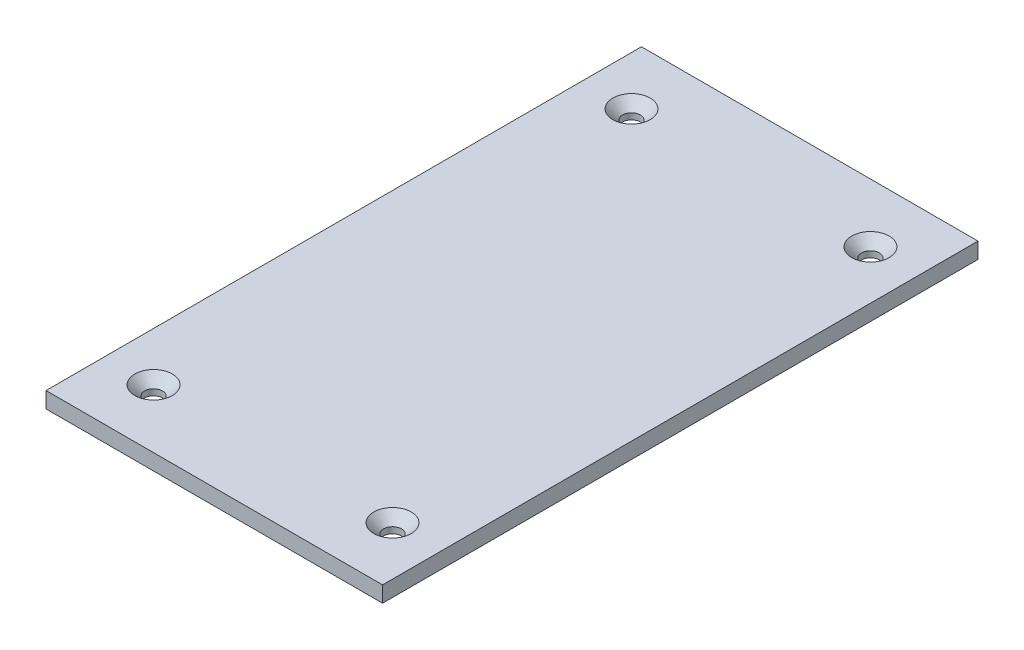
ISO-10303-21;
HEADER;
FILE_DESCRIPTION(('STEP AP214'),'2;1');
FILE_NAME('part.step','',(''),(''),'','','');
FILE_SCHEMA(('AUTOMOTIVE_DESIGN { 1 0 10303 214 1 1 1 1 }'));
ENDSEC;
DATA;
#1=APPLICATION_CONTEXT('core data for automotive mechanical design processes');
#2=APPLICATION_PROTOCOL_DEFINITION('international standard','automotive_design',2000,#1);
#3=PRODUCT_CONTEXT('',#1,'mechanical');
#4=PRODUCT('Part','Part','',(#3));
#5=PRODUCT_RELATED_PRODUCT_CATEGORY('part','',(#4));
#6=PRODUCT_DEFINITION_FORMATION('','',#4);
#7=PRODUCT_DEFINITION_CONTEXT('part definition',#1,'design');
#8=PRODUCT_DEFINITION('design','',#6,#7);
#9=PRODUCT_DEFINITION_SHAPE('','',#8);
#10=(LENGTH_UNIT() NAMED_UNIT(*) SI_UNIT(.MILLI.,.METRE.));
#11=(NAMED_UNIT(*) PLANE_ANGLE_UNIT() SI_UNIT($,.RADIAN.));
#12=(NAMED_UNIT(*) SI_UNIT($,.STERADIAN.) SOLID_ANGLE_UNIT());
#13=UNCERTAINTY_MEASURE_WITH_UNIT(LENGTH_MEASURE(1.E-05),#10,'distance_accuracy_value','');
#14=(GEOMETRIC_REPRESENTATION_CONTEXT(3) GLOBAL_UNCERTAINTY_ASSIGNED_CONTEXT((#13)) GLOBAL_UNIT_ASSIGNED_CONTEXT((#10,
#11,#12)) REPRESENTATION_CONTEXT('',''));
#15=CARTESIAN_POINT('',(0.,0.,0.));
#16=DIRECTION('',(0.,0.,1.));
#17=DIRECTION('',(1.,0.,0.));
#18=AXIS2_PLACEMENT_3D('',#15,#16,#17);
#19=CARTESIAN_POINT('',(-42.25,-4.,-74.75));
#20=DIRECTION('',(-1.,0.,0.));
#21=DIRECTION('',(0.,0.,1.));
#22=AXIS2_PLACEMENT_3D('',#19,#20,#21);
#23=PLANE('',#22);
#24=DIRECTION('',(0.,0.,1.));
#25=VECTOR('',#24,1.);
#26=CARTESIAN_POINT('',(-42.25,0.,-74.75));
#27=LINE('',#26,#25);
#28=CARTESIAN_POINT('',(-42.25,0.,-74.75));
#29=VERTEX_POINT('',#28);
#30=CARTESIAN_POINT('',(-42.25,0.,74.75));
#31=VERTEX_POINT('',#30);
#32=EDGE_CURVE('E101',#29,#31,#27,.T.);
#33=ORIENTED_EDGE('',*,*,#32,.F.);
#34=DIRECTION('',(0.,1.,0.));
#35=VECTOR('',#34,1.);
#36=CARTESIAN_POINT('',(-42.25,-4.,-74.75));
#37=LINE('',#36,#35);
#38=CARTESIAN_POINT('',(-42.25,-4.,-74.75));
#39=VERTEX_POINT('',#38);
#40=EDGE_CURVE('E11',#39,#29,#37,.T.);
#41=ORIENTED_EDGE('',*,*,#40,.F.);
#42=DIRECTION('',(0.,0.,1.));
#43=VECTOR('',#42,1.);
#44=CARTESIAN_POINT('',(-42.25,-4.,-74.75));
#45=LINE('',#44,#43);
#46=CARTESIAN_POINT('',(-42.25,-4.,74.75));
#47=VERTEX_POINT('',#46);
#48=EDGE_CURVE('E94',#39,#47,#45,.T.);
#49=ORIENTED_EDGE('',*,*,#48,.T.);
#50=DIRECTION('',(0.,1.,0.));
#51=VECTOR('',#50,1.);
#52=CARTESIAN_POINT('',(-42.25,-4.,74.75));
#53=LINE('',#52,#51);
#54=EDGE_CURVE('E39',#47,#31,#53,.T.);
#55=ORIENTED_EDGE('',*,*,#54,.T.);
#56=EDGE_LOOP('',(#33,#41,#49,#55));
#57=FACE_BOUND('',#56,.T.);
#58=ADVANCED_FACE('F36',(#57),#23,.T.);
#59=CARTESIAN_POINT('',(-42.25,-4.,-74.75));
#60=DIRECTION('',(0.,0.,-1.));
#61=DIRECTION('',(-1.,0.,0.));
#62=AXIS2_PLACEMENT_3D('',#59,#60,#61);
#63=PLANE('',#62);
#64=DIRECTION('',(-1.,0.,0.));
#65=VECTOR('',#64,1.);
#66=CARTESIAN_POINT('',(-42.25,0.,-74.75));
#67=LINE('',#66,#65);
#68=CARTESIAN_POINT('',(42.25,0.,-74.75));
#69=VERTEX_POINT('',#68);
#70=EDGE_CURVE('E96',#69,#29,#67,.T.);
#71=ORIENTED_EDGE('',*,*,#70,.F.);
#72=DIRECTION('',(0.,1.,0.));
#73=VECTOR('',#72,1.);
#74=CARTESIAN_POINT('',(42.25,-4.,-74.75));
#75=LINE('',#74,#73);
#76=CARTESIAN_POINT('',(42.25,-4.,-74.75));
#77=VERTEX_POINT('',#76);
#78=EDGE_CURVE('E45',#77,#69,#75,.T.);
#79=ORIENTED_EDGE('',*,*,#78,.F.);
#80=DIRECTION('',(-1.,0.,0.));
#81=VECTOR('',#80,1.);
#82=CARTESIAN_POINT('',(-42.25,-4.,-74.75));
#83=LINE('',#82,#81);
#84=EDGE_CURVE('E91',#77,#39,#83,.T.);
#85=ORIENTED_EDGE('',*,*,#84,.T.);
#86=ORIENTED_EDGE('',*,*,#40,.T.);
#87=EDGE_LOOP('',(#71,#79,#85,#86));
#88=FACE_BOUND('',#87,.T.);
#89=ADVANCED_FACE('F112',(#88),#63,.T.);
#90=CARTESIAN_POINT('',(42.25,-4.,-74.75));
#91=DIRECTION('',(1.,0.,0.));
#92=DIRECTION('',(0.,0.,-1.));
#93=AXIS2_PLACEMENT_3D('',#90,#91,#92);
#94=PLANE('',#93);
#95=DIRECTION('',(0.,0.,-1.));
#96=VECTOR('',#95,1.);
#97=CARTESIAN_POINT('',(42.25,0.,-74.75));
#98=LINE('',#97,#96);
#99=CARTESIAN_POINT('',(42.25,0.,74.75));
#100=VERTEX_POINT('',#99);
#101=EDGE_CURVE('E86',#100,#69,#98,.T.);
#102=ORIENTED_EDGE('',*,*,#101,.F.);
#103=DIRECTION('',(0.,1.,0.));
#104=VECTOR('',#103,1.);
#105=CARTESIAN_POINT('',(42.25,-4.,74.75));
#106=LINE('',#105,#104);
#107=CARTESIAN_POINT('',(42.25,-4.,74.75));
#108=VERTEX_POINT('',#107);
#109=EDGE_CURVE('E81',#108,#100,#106,.T.);
#110=ORIENTED_EDGE('',*,*,#109,.F.);
#111=DIRECTION('',(0.,0.,-1.));
#112=VECTOR('',#111,1.);
#113=CARTESIAN_POINT('',(42.25,-4.,-74.75));
#114=LINE('',#113,#112);
#115=EDGE_CURVE('E84',#108,#77,#114,.T.);
#116=ORIENTED_EDGE('',*,*,#115,.T.);
#117=ORIENTED_EDGE('',*,*,#78,.T.);
#118=EDGE_LOOP('',(#102,#110,#116,#117));
#119=FACE_BOUND('',#118,.T.);
#120=ADVANCED_FACE('F83',(#119),#94,.T.);
#121=CARTESIAN_POINT('',(-42.25,-4.,74.75));
#122=DIRECTION('',(0.,0.,1.));
#123=DIRECTION('',(1.,0.,0.));
#124=AXIS2_PLACEMENT_3D('',#121,#122,#123);
#125=PLANE('',#124);
#126=DIRECTION('',(1.,0.,0.));
#127=VECTOR('',#126,1.);
#128=CARTESIAN_POINT('',(-42.25,0.,74.75));
#129=LINE('',#128,#127);
#130=EDGE_CURVE('E104',#31,#100,#129,.T.);
#131=ORIENTED_EDGE('',*,*,#130,.F.);
#132=ORIENTED_EDGE('',*,*,#54,.F.);
#133=DIRECTION('',(1.,0.,0.));
#134=VECTOR('',#133,1.);
#135=CARTESIAN_POINT('',(-42.25,-4.,74.75));
#136=LINE('',#135,#134);
#137=EDGE_CURVE('E90',#47,#108,#136,.T.);
#138=ORIENTED_EDGE('',*,*,#137,.T.);
#139=ORIENTED_EDGE('',*,*,#109,.T.);
#140=EDGE_LOOP('',(#131,#132,#138,#139));
#141=FACE_BOUND('',#140,.T.);
#142=ADVANCED_FACE('F93',(#141),#125,.T.);
#143=CARTESIAN_POINT('',(0.,-4.,0.));
#144=DIRECTION('',(0.,1.,0.));
#145=DIRECTION('',(0.,0.,1.));
#146=AXIS2_PLACEMENT_3D('',#143,#144,#145);
#147=PLANE('',#146);
#148=CARTESIAN_POINT('',(30.,-4.,-60.));
#149=DIRECTION('',(0.,1.,0.));
#150=DIRECTION('',(0.,0.,1.));
#151=AXIS2_PLACEMENT_3D('',#148,#149,#150);
#152=CIRCLE('',#151,2.24999999999998);
#153=CARTESIAN_POINT('',(30.,-4.,-57.75));
#154=VERTEX_POINT('',#153);
#155=EDGE_CURVE('E175',#154,#154,#152,.T.);
#156=ORIENTED_EDGE('',*,*,#155,.T.);
#157=EDGE_LOOP('',(#156));
#158=FACE_BOUND('',#157,.T.);
#159=CARTESIAN_POINT('',(-30.,-4.,-60.));
#160=DIRECTION('',(0.,1.,0.));
#161=DIRECTION('',(0.,0.,1.));
#162=AXIS2_PLACEMENT_3D('',#159,#160,#161);
#163=CIRCLE('',#162,2.24999999999999);
#164=CARTESIAN_POINT('',(-30.,-4.,-57.75));
#165=VERTEX_POINT('',#164);
#166=EDGE_CURVE('E185',#165,#165,#163,.T.);
#167=ORIENTED_EDGE('',*,*,#166,.T.);
#168=EDGE_LOOP('',(#167));
#169=FACE_BOUND('',#168,.T.);
#170=CARTESIAN_POINT('',(-30.,-4.,60.));
#171=DIRECTION('',(0.,1.,0.));
#172=DIRECTION('',(0.,0.,1.));
#173=AXIS2_PLACEMENT_3D('',#170,#171,#172);
#174=CIRCLE('',#173,2.24999999999999);
#175=CARTESIAN_POINT('',(-30.,-4.,62.25));
#176=VERTEX_POINT('',#175);
#177=EDGE_CURVE('E194',#176,#176,#174,.T.);
#178=ORIENTED_EDGE('',*,*,#177,.T.);
#179=EDGE_LOOP('',(#178));
#180=FACE_BOUND('',#179,.T.);
#181=CARTESIAN_POINT('',(30.,-4.,60.));
#182=DIRECTION('',(0.,1.,0.));
#183=DIRECTION('',(0.,0.,1.));
#184=AXIS2_PLACEMENT_3D('',#181,#182,#183);
#185=CIRCLE('',#184,2.24999999999998);
#186=CARTESIAN_POINT('',(30.,-4.,62.25));
#187=VERTEX_POINT('',#186);
#188=EDGE_CURVE('E105',#187,#187,#185,.T.);
#189=ORIENTED_EDGE('',*,*,#188,.T.);
#190=EDGE_LOOP('',(#189));
#191=FACE_BOUND('',#190,.T.);
#192=ORIENTED_EDGE('',*,*,#48,.F.);
#193=ORIENTED_EDGE('',*,*,#84,.F.);
#194=ORIENTED_EDGE('',*,*,#115,.F.);
#195=ORIENTED_EDGE('',*,*,#137,.F.);
#196=EDGE_LOOP('',(#192,#193,#194,#195));
#197=FACE_BOUND('',#196,.T.);
#198=ADVANCED_FACE('F89',(#158,#169,#180,#191,#197),#147,.F.);
#199=CARTESIAN_POINT('',(0.,0.,0.));
#200=DIRECTION('',(0.,1.,0.));
#201=DIRECTION('',(0.,0.,1.));
#202=AXIS2_PLACEMENT_3D('',#199,#200,#201);
#203=PLANE('',#202);
#204=CARTESIAN_POINT('',(30.,0.,-60.));
#205=DIRECTION('',(0.,1.,0.));
#206=DIRECTION('',(0.,0.,1.));
#207=AXIS2_PLACEMENT_3D('',#204,#205,#206);
#208=CIRCLE('',#207,4.7);
#209=CARTESIAN_POINT('',(30.,0.,-55.3));
#210=VERTEX_POINT('',#209);
#211=EDGE_CURVE('E173',#210,#210,#208,.T.);
#212=ORIENTED_EDGE('',*,*,#211,.F.);
#213=EDGE_LOOP('',(#212));
#214=FACE_BOUND('',#213,.T.);
#215=CARTESIAN_POINT('',(-30.,0.,-60.));
#216=DIRECTION('',(0.,1.,0.));
#217=DIRECTION('',(0.,0.,1.));
#218=AXIS2_PLACEMENT_3D('',#215,#216,#217);
#219=CIRCLE('',#218,4.7);
#220=CARTESIAN_POINT('',(-30.,0.,-55.3));
#221=VERTEX_POINT('',#220);
#222=EDGE_CURVE('E179',#221,#221,#219,.T.);
#223=ORIENTED_EDGE('',*,*,#222,.F.);
#224=EDGE_LOOP('',(#223));
#225=FACE_BOUND('',#224,.T.);
#226=CARTESIAN_POINT('',(-30.,0.,60.));
#227=DIRECTION('',(0.,1.,0.));
#228=DIRECTION('',(0.,0.,1.));
#229=AXIS2_PLACEMENT_3D('',#226,#227,#228);
#230=CIRCLE('',#229,4.7);
#231=CARTESIAN_POINT('',(-30.,0.,64.7));
#232=VERTEX_POINT('',#231);
#233=EDGE_CURVE('E188',#232,#232,#230,.T.);
#234=ORIENTED_EDGE('',*,*,#233,.F.);
#235=EDGE_LOOP('',(#234));
#236=FACE_BOUND('',#235,.T.);
#237=CARTESIAN_POINT('',(30.,0.,60.));
#238=DIRECTION('',(0.,1.,0.));
#239=DIRECTION('',(0.,0.,1.));
#240=AXIS2_PLACEMENT_3D('',#237,#238,#239);
#241=CIRCLE('',#240,4.7);
#242=CARTESIAN_POINT('',(30.,0.,64.7));
#243=VERTEX_POINT('',#242);
#244=EDGE_CURVE('E197',#243,#243,#241,.T.);
#245=ORIENTED_EDGE('',*,*,#244,.F.);
#246=EDGE_LOOP('',(#245));
#247=FACE_BOUND('',#246,.T.);
#248=ORIENTED_EDGE('',*,*,#32,.T.);
#249=ORIENTED_EDGE('',*,*,#130,.T.);
#250=ORIENTED_EDGE('',*,*,#101,.T.);
#251=ORIENTED_EDGE('',*,*,#70,.T.);
#252=EDGE_LOOP('',(#248,#249,#250,#251));
#253=FACE_BOUND('',#252,.T.);
#254=ADVANCED_FACE('F111',(#214,#225,#236,#247,#253),#203,.T.);
#255=CARTESIAN_POINT('',(30.,0.,60.));
#256=DIRECTION('',(0.,1.,0.));
#257=DIRECTION('',(0.,0.,1.));
#258=AXIS2_PLACEMENT_3D('',#255,#256,#257);
#259=CYLINDRICAL_SURFACE('',#258,2.24999999999999);
#260=ORIENTED_EDGE('',*,*,#188,.F.);
#261=EDGE_LOOP('',(#260));
#262=FACE_BOUND('',#261,.T.);
#263=CARTESIAN_POINT('',(30.,-2.45,60.));
#264=DIRECTION('',(0.,1.,0.));
#265=DIRECTION('',(0.,0.,1.));
#266=AXIS2_PLACEMENT_3D('',#263,#264,#265);
#267=CIRCLE('',#266,2.25);
#268=CARTESIAN_POINT('',(30.,-2.45,62.25));
#269=VERTEX_POINT('',#268);
#270=EDGE_CURVE('E200',#269,#269,#267,.T.);
#271=ORIENTED_EDGE('',*,*,#270,.T.);
#272=EDGE_LOOP('',(#271));
#273=FACE_BOUND('',#272,.T.);
#274=ADVANCED_FACE('F130',(#262,#273),#259,.F.);
#275=CARTESIAN_POINT('',(30.,0.,60.));
#276=DIRECTION('',(0.,1.,0.));
#277=DIRECTION('',(0.,0.,1.));
#278=AXIS2_PLACEMENT_3D('',#275,#276,#277);
#279=CONICAL_SURFACE('',#278,4.7,0.785398163397449);
#280=ORIENTED_EDGE('',*,*,#270,.F.);
#281=EDGE_LOOP('',(#280));
#282=FACE_BOUND('',#281,.T.);
#283=ORIENTED_EDGE('',*,*,#244,.T.);
#284=EDGE_LOOP('',(#283));
#285=FACE_BOUND('',#284,.T.);
#286=ADVANCED_FACE('F137',(#282,#285),#279,.F.);
#287=CARTESIAN_POINT('',(-30.,0.,60.));
#288=DIRECTION('',(0.,1.,0.));
#289=DIRECTION('',(0.,0.,1.));
#290=AXIS2_PLACEMENT_3D('',#287,#288,#289);
#291=CYLINDRICAL_SURFACE('',#290,2.24999999999999);
#292=ORIENTED_EDGE('',*,*,#177,.F.);
#293=EDGE_LOOP('',(#292));
#294=FACE_BOUND('',#293,.T.);
#295=CARTESIAN_POINT('',(-30.,-2.45,60.));
#296=DIRECTION('',(0.,1.,0.));
#297=DIRECTION('',(0.,0.,1.));
#298=AXIS2_PLACEMENT_3D('',#295,#296,#297);
#299=CIRCLE('',#298,2.25);
#300=CARTESIAN_POINT('',(-30.,-2.45,62.25));
#301=VERTEX_POINT('',#300);
#302=EDGE_CURVE('E191',#301,#301,#299,.T.);
#303=ORIENTED_EDGE('',*,*,#302,.T.);
#304=EDGE_LOOP('',(#303));
#305=FACE_BOUND('',#304,.T.);
#306=ADVANCED_FACE('F141',(#294,#305),#291,.F.);
#307=CARTESIAN_POINT('',(-30.,0.,60.));
#308=DIRECTION('',(0.,1.,0.));
#309=DIRECTION('',(0.,0.,1.));
#310=AXIS2_PLACEMENT_3D('',#307,#308,#309);
#311=CONICAL_SURFACE('',#310,4.7,0.785398163397449);
#312=ORIENTED_EDGE('',*,*,#302,.F.);
#313=EDGE_LOOP('',(#312));
#314=FACE_BOUND('',#313,.T.);
#315=ORIENTED_EDGE('',*,*,#233,.T.);
#316=EDGE_LOOP('',(#315));
#317=FACE_BOUND('',#316,.T.);
#318=ADVANCED_FACE('F145',(#314,#317),#311,.F.);
#319=CARTESIAN_POINT('',(-30.,0.,-60.));
#320=DIRECTION('',(0.,1.,0.));
#321=DIRECTION('',(0.,0.,1.));
#322=AXIS2_PLACEMENT_3D('',#319,#320,#321);
#323=CYLINDRICAL_SURFACE('',#322,2.24999999999999);
#324=ORIENTED_EDGE('',*,*,#166,.F.);
#325=EDGE_LOOP('',(#324));
#326=FACE_BOUND('',#325,.T.);
#327=CARTESIAN_POINT('',(-30.,-2.45,-60.));
#328=DIRECTION('',(0.,1.,0.));
#329=DIRECTION('',(0.,0.,1.));
#330=AXIS2_PLACEMENT_3D('',#327,#328,#329);
#331=CIRCLE('',#330,2.25);
#332=CARTESIAN_POINT('',(-30.,-2.45,-57.75));
#333=VERTEX_POINT('',#332);
#334=EDGE_CURVE('E182',#333,#333,#331,.T.);
#335=ORIENTED_EDGE('',*,*,#334,.T.);
#336=EDGE_LOOP('',(#335));
#337=FACE_BOUND('',#336,.T.);
#338=ADVANCED_FACE('F149',(#326,#337),#323,.F.);
#339=CARTESIAN_POINT('',(-30.,0.,-60.));
#340=DIRECTION('',(0.,1.,0.));
#341=DIRECTION('',(0.,0.,1.));
#342=AXIS2_PLACEMENT_3D('',#339,#340,#341);
#343=CONICAL_SURFACE('',#342,4.7,0.785398163397449);
#344=ORIENTED_EDGE('',*,*,#334,.F.);
#345=EDGE_LOOP('',(#344));
#346=FACE_BOUND('',#345,.T.);
#347=ORIENTED_EDGE('',*,*,#222,.T.);
#348=EDGE_LOOP('',(#347));
#349=FACE_BOUND('',#348,.T.);
#350=ADVANCED_FACE('F153',(#346,#349),#343,.F.);
#351=CARTESIAN_POINT('',(30.,0.,-60.));
#352=DIRECTION('',(0.,1.,0.));
#353=DIRECTION('',(0.,0.,1.));
#354=AXIS2_PLACEMENT_3D('',#351,#352,#353);
#355=CYLINDRICAL_SURFACE('',#354,2.24999999999999);
#356=ORIENTED_EDGE('',*,*,#155,.F.);
#357=EDGE_LOOP('',(#356));
#358=FACE_BOUND('',#357,.T.);
#359=CARTESIAN_POINT('',(30.,-2.45,-60.));
#360=DIRECTION('',(0.,1.,0.));
#361=DIRECTION('',(0.,0.,1.));
#362=AXIS2_PLACEMENT_3D('',#359,#360,#361);
#363=CIRCLE('',#362,2.25);
#364=CARTESIAN_POINT('',(30.,-2.45,-57.75));
#365=VERTEX_POINT('',#364);
#366=EDGE_CURVE('E170',#365,#365,#363,.T.);
#367=ORIENTED_EDGE('',*,*,#366,.T.);
#368=EDGE_LOOP('',(#367));
#369=FACE_BOUND('',#368,.T.);
#370=ADVANCED_FACE('F157',(#358,#369),#355,.F.);
#371=CARTESIAN_POINT('',(30.,0.,-60.));
#372=DIRECTION('',(0.,1.,0.));
#373=DIRECTION('',(0.,0.,1.));
#374=AXIS2_PLACEMENT_3D('',#371,#372,#373);
#375=CONICAL_SURFACE('',#374,4.7,0.785398163397449);
#376=ORIENTED_EDGE('',*,*,#366,.F.);
#377=EDGE_LOOP('',(#376));
#378=FACE_BOUND('',#377,.T.);
#379=ORIENTED_EDGE('',*,*,#211,.T.);
#380=EDGE_LOOP('',(#379));
#381=FACE_BOUND('',#380,.T.);
#382=ADVANCED_FACE('F161',(#378,#381),#375,.F.);
#383=CLOSED_SHELL('',(#58,#89,#120,#142,#198,#254,#274,#286,#306,#318,#338,#350,#370,#382));
#384=MANIFOLD_SOLID_BREP('B2',#383);
#385=ADVANCED_BREP_SHAPE_REPRESENTATION('',(#18,#384),#14);
#386=SHAPE_DEFINITION_REPRESENTATION(#9,#385);
ENDSEC;
END-ISO-10303-21;
